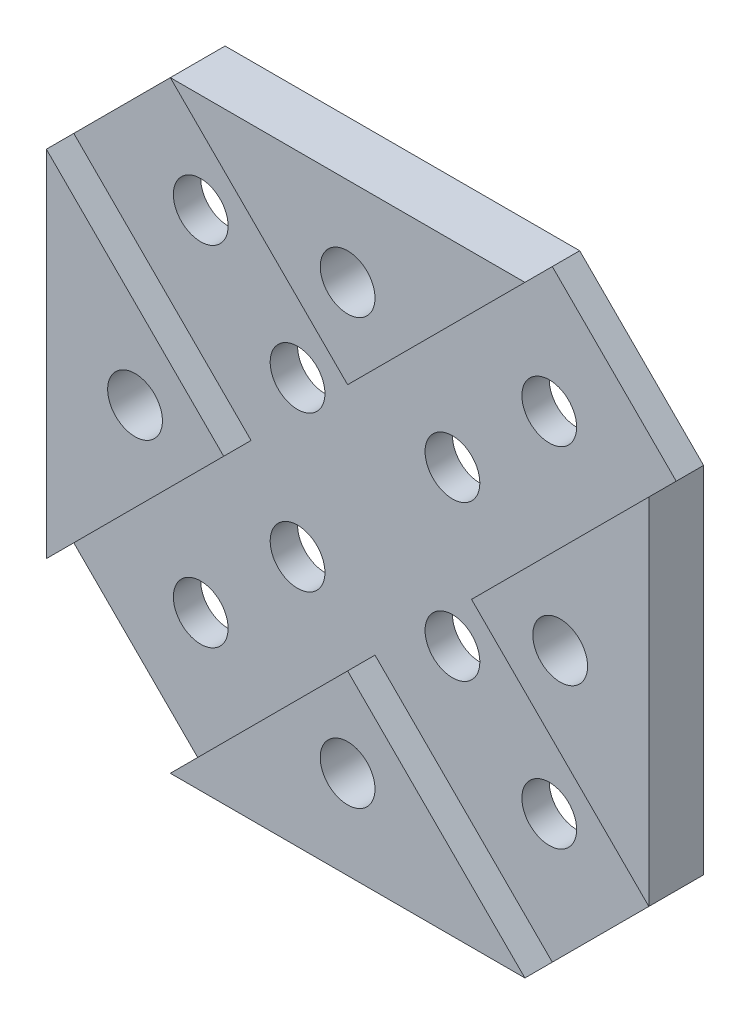
ISO-10303-21;
HEADER;
FILE_DESCRIPTION(('STEP AP214'),'2;1');
FILE_NAME('part.step','',(''),(''),'','','');
FILE_SCHEMA(('AUTOMOTIVE_DESIGN { 1 0 10303 214 1 1 1 1 }'));
ENDSEC;
DATA;
#1=APPLICATION_CONTEXT('core data for automotive mechanical design processes');
#2=APPLICATION_PROTOCOL_DEFINITION('international standard','automotive_design',2000,#1);
#3=PRODUCT_CONTEXT('',#1,'mechanical');
#4=PRODUCT('Part','Part','',(#3));
#5=PRODUCT_RELATED_PRODUCT_CATEGORY('part','',(#4));
#6=PRODUCT_DEFINITION_FORMATION('','',#4);
#7=PRODUCT_DEFINITION_CONTEXT('part definition',#1,'design');
#8=PRODUCT_DEFINITION('design','',#6,#7);
#9=PRODUCT_DEFINITION_SHAPE('','',#8);
#10=(LENGTH_UNIT() NAMED_UNIT(*) SI_UNIT(.MILLI.,.METRE.));
#11=(NAMED_UNIT(*) PLANE_ANGLE_UNIT() SI_UNIT($,.RADIAN.));
#12=(NAMED_UNIT(*) SI_UNIT($,.STERADIAN.) SOLID_ANGLE_UNIT());
#13=UNCERTAINTY_MEASURE_WITH_UNIT(LENGTH_MEASURE(1.E-05),#10,'distance_accuracy_value','');
#14=(GEOMETRIC_REPRESENTATION_CONTEXT(3) GLOBAL_UNCERTAINTY_ASSIGNED_CONTEXT((#13)) GLOBAL_UNIT_ASSIGNED_CONTEXT((#10,
#11,#12)) REPRESENTATION_CONTEXT('',''));
#15=CARTESIAN_POINT('',(0.,0.,0.));
#16=DIRECTION('',(0.,0.,1.));
#17=DIRECTION('',(1.,0.,0.));
#18=AXIS2_PLACEMENT_3D('',#15,#16,#17);
#19=CARTESIAN_POINT('',(0.,0.,10.));
#20=DIRECTION('',(0.,0.,1.));
#21=DIRECTION('',(1.,0.,0.));
#22=AXIS2_PLACEMENT_3D('',#19,#20,#21);
#23=PLANE('',#22);
#24=CARTESIAN_POINT('',(0.,38.8137084989848,10.));
#25=DIRECTION('',(0.,0.,1.));
#26=DIRECTION('',(1.,0.,0.));
#27=AXIS2_PLACEMENT_3D('',#24,#25,#26);
#28=CIRCLE('',#27,5.);
#29=CARTESIAN_POINT('',(4.99999999999997,38.8137084989848,10.));
#30=VERTEX_POINT('',#29);
#31=EDGE_CURVE('E531',#30,#30,#28,.T.);
#32=ORIENTED_EDGE('',*,*,#31,.F.);
#33=EDGE_LOOP('',(#32));
#34=FACE_BOUND('',#33,.T.);
#35=DIRECTION('',(-0.707106781186548,0.707106781186548,0.));
#36=VECTOR('',#35,1.);
#37=CARTESIAN_POINT('',(-32.3725830020304,55.,10.));
#38=LINE('',#37,#36);
#39=CARTESIAN_POINT('',(0.,22.6274169979695,10.));
#40=VERTEX_POINT('',#39);
#41=CARTESIAN_POINT('',(-32.3725830020304,55.,10.));
#42=VERTEX_POINT('',#41);
#43=EDGE_CURVE('E172',#40,#42,#38,.T.);
#44=ORIENTED_EDGE('',*,*,#43,.F.);
#45=DIRECTION('',(-0.707106781186547,-0.707106781186548,0.));
#46=VECTOR('',#45,1.);
#47=CARTESIAN_POINT('',(32.3725830020304,55.,10.));
#48=LINE('',#47,#46);
#49=CARTESIAN_POINT('',(32.3725830020304,55.,10.));
#50=VERTEX_POINT('',#49);
#51=EDGE_CURVE('E174',#50,#40,#48,.T.);
#52=ORIENTED_EDGE('',*,*,#51,.F.);
#53=DIRECTION('',(-1.,0.,0.));
#54=VECTOR('',#53,1.);
#55=CARTESIAN_POINT('',(0.,55.,10.));
#56=LINE('',#55,#54);
#57=EDGE_CURVE('E236',#50,#42,#56,.T.);
#58=ORIENTED_EDGE('',*,*,#57,.T.);
#59=EDGE_LOOP('',(#44,#52,#58));
#60=FACE_BOUND('',#59,.T.);
#61=ADVANCED_FACE('F36',(#34,#60),#23,.T.);
#62=CARTESIAN_POINT('',(38.8137084989848,0.,10.));
#63=DIRECTION('',(0.,0.,1.));
#64=DIRECTION('',(1.,0.,0.));
#65=AXIS2_PLACEMENT_3D('',#62,#63,#64);
#66=CIRCLE('',#65,5.);
#67=CARTESIAN_POINT('',(43.8137084989848,0.,10.));
#68=VERTEX_POINT('',#67);
#69=EDGE_CURVE('E563',#68,#68,#66,.T.);
#70=ORIENTED_EDGE('',*,*,#69,.F.);
#71=EDGE_LOOP('',(#70));
#72=FACE_BOUND('',#71,.T.);
#73=DIRECTION('',(0.707106781186547,0.707106781186548,0.));
#74=VECTOR('',#73,1.);
#75=CARTESIAN_POINT('',(22.6274169979695,0.,10.));
#76=LINE('',#75,#74);
#77=CARTESIAN_POINT('',(22.6274169979695,0.,10.));
#78=VERTEX_POINT('',#77);
#79=CARTESIAN_POINT('',(55.,32.3725830020305,10.));
#80=VERTEX_POINT('',#79);
#81=EDGE_CURVE('E216',#78,#80,#76,.T.);
#82=ORIENTED_EDGE('',*,*,#81,.F.);
#83=DIRECTION('',(-0.707106781186547,0.707106781186548,0.));
#84=VECTOR('',#83,1.);
#85=CARTESIAN_POINT('',(22.6274169979695,0.,10.));
#86=LINE('',#85,#84);
#87=CARTESIAN_POINT('',(55.,-32.3725830020305,10.));
#88=VERTEX_POINT('',#87);
#89=EDGE_CURVE('E213',#88,#78,#86,.T.);
#90=ORIENTED_EDGE('',*,*,#89,.F.);
#91=DIRECTION('',(0.,1.,0.));
#92=VECTOR('',#91,1.);
#93=CARTESIAN_POINT('',(55.,0.,10.));
#94=LINE('',#93,#92);
#95=EDGE_CURVE('E233',#88,#80,#94,.T.);
#96=ORIENTED_EDGE('',*,*,#95,.T.);
#97=EDGE_LOOP('',(#82,#90,#96));
#98=FACE_BOUND('',#97,.T.);
#99=ADVANCED_FACE('F327',(#72,#98),#23,.T.);
#100=CARTESIAN_POINT('',(0.,-38.8137084989848,10.));
#101=DIRECTION('',(0.,0.,1.));
#102=DIRECTION('',(1.,0.,0.));
#103=AXIS2_PLACEMENT_3D('',#100,#101,#102);
#104=CIRCLE('',#103,5.);
#105=CARTESIAN_POINT('',(5.,-38.8137084989848,10.));
#106=VERTEX_POINT('',#105);
#107=EDGE_CURVE('E363',#106,#106,#104,.T.);
#108=ORIENTED_EDGE('',*,*,#107,.F.);
#109=EDGE_LOOP('',(#108));
#110=FACE_BOUND('',#109,.T.);
#111=DIRECTION('',(0.707106781186548,-0.707106781186547,0.));
#112=VECTOR('',#111,1.);
#113=CARTESIAN_POINT('',(32.3725830020306,-54.9999999999999,10.));
#114=LINE('',#113,#112);
#115=CARTESIAN_POINT('',(0.,-22.6274169979695,10.));
#116=VERTEX_POINT('',#115);
#117=CARTESIAN_POINT('',(32.3725830020306,-54.9999999999999,10.));
#118=VERTEX_POINT('',#117);
#119=EDGE_CURVE('E211',#116,#118,#114,.T.);
#120=ORIENTED_EDGE('',*,*,#119,.F.);
#121=DIRECTION('',(0.707106781186547,0.707106781186548,0.));
#122=VECTOR('',#121,1.);
#123=CARTESIAN_POINT('',(-32.3725830020304,-55.,10.));
#124=LINE('',#123,#122);
#125=CARTESIAN_POINT('',(-32.3725830020304,-55.,10.));
#126=VERTEX_POINT('',#125);
#127=EDGE_CURVE('E208',#126,#116,#124,.T.);
#128=ORIENTED_EDGE('',*,*,#127,.F.);
#129=DIRECTION('',(-1.,0.,0.));
#130=VECTOR('',#129,1.);
#131=CARTESIAN_POINT('',(0.,-55.,10.));
#132=LINE('',#131,#130);
#133=EDGE_CURVE('E229',#118,#126,#132,.T.);
#134=ORIENTED_EDGE('',*,*,#133,.F.);
#135=EDGE_LOOP('',(#120,#128,#134));
#136=FACE_BOUND('',#135,.T.);
#137=ADVANCED_FACE('F334',(#110,#136),#23,.T.);
#138=CARTESIAN_POINT('',(-55.,0.,10.));
#139=DIRECTION('',(-1.,0.,0.));
#140=DIRECTION('',(0.,0.,1.));
#141=AXIS2_PLACEMENT_3D('',#138,#139,#140);
#142=PLANE('',#141);
#143=DIRECTION('',(0.,1.,0.));
#144=VECTOR('',#143,1.);
#145=CARTESIAN_POINT('',(-55.,0.,0.));
#146=LINE('',#145,#144);
#147=CARTESIAN_POINT('',(-55.,-32.3725830020305,0.));
#148=VERTEX_POINT('',#147);
#149=CARTESIAN_POINT('',(-55.,32.3725830020305,0.));
#150=VERTEX_POINT('',#149);
#151=EDGE_CURVE('E222',#148,#150,#146,.T.);
#152=ORIENTED_EDGE('',*,*,#151,.F.);
#153=DIRECTION('',(0.,0.,-1.));
#154=VECTOR('',#153,1.);
#155=CARTESIAN_POINT('',(-55.,-32.3725830020305,10.));
#156=LINE('',#155,#154);
#157=CARTESIAN_POINT('',(-55.,-32.3725830020305,5.));
#158=VERTEX_POINT('',#157);
#159=EDGE_CURVE('E45',#158,#148,#156,.T.);
#160=ORIENTED_EDGE('',*,*,#159,.F.);
#161=CARTESIAN_POINT('',(-55.,-32.3725830020305,10.));
#162=VERTEX_POINT('',#161);
#163=EDGE_CURVE('E11',#162,#158,#156,.T.);
#164=ORIENTED_EDGE('',*,*,#163,.F.);
#165=DIRECTION('',(0.,1.,0.));
#166=VECTOR('',#165,1.);
#167=CARTESIAN_POINT('',(-55.,0.,10.));
#168=LINE('',#167,#166);
#169=CARTESIAN_POINT('',(-55.,32.3725830020305,10.));
#170=VERTEX_POINT('',#169);
#171=EDGE_CURVE('E226',#162,#170,#168,.T.);
#172=ORIENTED_EDGE('',*,*,#171,.T.);
#173=DIRECTION('',(0.,0.,-1.));
#174=VECTOR('',#173,1.);
#175=CARTESIAN_POINT('',(-55.,32.3725830020305,10.));
#176=LINE('',#175,#174);
#177=CARTESIAN_POINT('',(-55.,32.3725830020305,5.));
#178=VERTEX_POINT('',#177);
#179=EDGE_CURVE('E260',#170,#178,#176,.T.);
#180=ORIENTED_EDGE('',*,*,#179,.T.);
#181=EDGE_CURVE('E61',#178,#150,#176,.T.);
#182=ORIENTED_EDGE('',*,*,#181,.T.);
#183=EDGE_LOOP('',(#152,#160,#164,#172,#180,#182));
#184=FACE_BOUND('',#183,.T.);
#185=ADVANCED_FACE('F38',(#184),#142,.T.);
#186=CARTESIAN_POINT('',(-43.6862915010151,-43.6862915010153,10.));
#187=DIRECTION('',(0.707106781186546,0.707106781186549,0.));
#188=DIRECTION('',(-0.707106781186549,0.707106781186546,0.));
#189=AXIS2_PLACEMENT_3D('',#186,#187,#188);
#190=PLANE('',#189);
#191=DIRECTION('',(0.,0.,-1.));
#192=VECTOR('',#191,1.);
#193=CARTESIAN_POINT('',(-32.3725830020304,-55.,10.));
#194=LINE('',#193,#192);
#195=CARTESIAN_POINT('',(-32.3725830020304,-55.,5.));
#196=VERTEX_POINT('',#195);
#197=CARTESIAN_POINT('',(-32.3725830020304,-55.,0.));
#198=VERTEX_POINT('',#197);
#199=EDGE_CURVE('E279',#196,#198,#194,.T.);
#200=ORIENTED_EDGE('',*,*,#199,.F.);
#201=DIRECTION('',(0.707106781186549,-0.707106781186546,0.));
#202=VECTOR('',#201,1.);
#203=CARTESIAN_POINT('',(-55.,-32.3725830020305,5.));
#204=LINE('',#203,#202);
#205=EDGE_CURVE('E167',#158,#196,#204,.T.);
#206=ORIENTED_EDGE('',*,*,#205,.F.);
#207=ORIENTED_EDGE('',*,*,#159,.T.);
#208=DIRECTION('',(0.707106781186549,-0.707106781186546,0.));
#209=VECTOR('',#208,1.);
#210=CARTESIAN_POINT('',(-43.6862915010151,-43.6862915010153,0.));
#211=LINE('',#210,#209);
#212=EDGE_CURVE('E240',#148,#198,#211,.T.);
#213=ORIENTED_EDGE('',*,*,#212,.T.);
#214=EDGE_LOOP('',(#200,#206,#207,#213));
#215=FACE_BOUND('',#214,.T.);
#216=ADVANCED_FACE('F359',(#215),#190,.F.);
#217=CARTESIAN_POINT('',(0.,-55.,10.));
#218=DIRECTION('',(0.,-1.,0.));
#219=DIRECTION('',(0.,0.,-1.));
#220=AXIS2_PLACEMENT_3D('',#217,#218,#219);
#221=PLANE('',#220);
#222=DIRECTION('',(-1.,0.,0.));
#223=VECTOR('',#222,1.);
#224=CARTESIAN_POINT('',(0.,-55.,0.));
#225=LINE('',#224,#223);
#226=CARTESIAN_POINT('',(32.3725830020304,-55.,0.));
#227=VERTEX_POINT('',#226);
#228=EDGE_CURVE('E243',#227,#198,#225,.T.);
#229=ORIENTED_EDGE('',*,*,#228,.F.);
#230=DIRECTION('',(0.,0.,-1.));
#231=VECTOR('',#230,1.);
#232=CARTESIAN_POINT('',(32.3725830020304,-55.,10.));
#233=LINE('',#232,#231);
#234=CARTESIAN_POINT('',(32.3725830020306,-54.9999999999999,5.));
#235=VERTEX_POINT('',#234);
#236=EDGE_CURVE('E276',#235,#227,#233,.T.);
#237=ORIENTED_EDGE('',*,*,#236,.F.);
#238=EDGE_CURVE('E277',#118,#235,#233,.T.);
#239=ORIENTED_EDGE('',*,*,#238,.F.);
#240=ORIENTED_EDGE('',*,*,#133,.T.);
#241=EDGE_CURVE('E280',#126,#196,#194,.T.);
#242=ORIENTED_EDGE('',*,*,#241,.T.);
#243=ORIENTED_EDGE('',*,*,#199,.T.);
#244=EDGE_LOOP('',(#229,#237,#239,#240,#242,#243));
#245=FACE_BOUND('',#244,.T.);
#246=ADVANCED_FACE('F374',(#245),#221,.T.);
#247=CARTESIAN_POINT('',(43.6862915010151,-43.6862915010153,10.));
#248=DIRECTION('',(0.707106781186546,-0.707106781186549,0.));
#249=DIRECTION('',(0.707106781186549,0.707106781186546,0.));
#250=AXIS2_PLACEMENT_3D('',#247,#248,#249);
#251=PLANE('',#250);
#252=DIRECTION('',(0.707106781186547,0.707106781186548,0.));
#253=VECTOR('',#252,1.);
#254=CARTESIAN_POINT('',(55.,-32.3725830020305,5.));
#255=LINE('',#254,#253);
#256=CARTESIAN_POINT('',(55.,-32.3725830020305,5.));
#257=VERTEX_POINT('',#256);
#258=EDGE_CURVE('E187',#235,#257,#255,.T.);
#259=ORIENTED_EDGE('',*,*,#258,.F.);
#260=ORIENTED_EDGE('',*,*,#236,.T.);
#261=DIRECTION('',(-0.707106781186549,-0.707106781186546,0.));
#262=VECTOR('',#261,1.);
#263=CARTESIAN_POINT('',(43.6862915010151,-43.6862915010153,0.));
#264=LINE('',#263,#262);
#265=CARTESIAN_POINT('',(55.,-32.3725830020305,0.));
#266=VERTEX_POINT('',#265);
#267=EDGE_CURVE('E246',#266,#227,#264,.T.);
#268=ORIENTED_EDGE('',*,*,#267,.F.);
#269=DIRECTION('',(0.,0.,-1.));
#270=VECTOR('',#269,1.);
#271=CARTESIAN_POINT('',(55.,-32.3725830020305,10.));
#272=LINE('',#271,#270);
#273=EDGE_CURVE('E272',#257,#266,#272,.T.);
#274=ORIENTED_EDGE('',*,*,#273,.F.);
#275=EDGE_LOOP('',(#259,#260,#268,#274));
#276=FACE_BOUND('',#275,.T.);
#277=ADVANCED_FACE('F378',(#276),#251,.T.);
#278=CARTESIAN_POINT('',(55.,0.,10.));
#279=DIRECTION('',(-1.,0.,0.));
#280=DIRECTION('',(0.,0.,1.));
#281=AXIS2_PLACEMENT_3D('',#278,#279,#280);
#282=PLANE('',#281);
#283=DIRECTION('',(0.,1.,0.));
#284=VECTOR('',#283,1.);
#285=CARTESIAN_POINT('',(55.,0.,0.));
#286=LINE('',#285,#284);
#287=CARTESIAN_POINT('',(55.,32.3725830020305,0.));
#288=VERTEX_POINT('',#287);
#289=EDGE_CURVE('E249',#266,#288,#286,.T.);
#290=ORIENTED_EDGE('',*,*,#289,.T.);
#291=DIRECTION('',(0.,0.,-1.));
#292=VECTOR('',#291,1.);
#293=CARTESIAN_POINT('',(55.,32.3725830020305,10.));
#294=LINE('',#293,#292);
#295=CARTESIAN_POINT('',(55.,32.3725830020305,5.));
#296=VERTEX_POINT('',#295);
#297=EDGE_CURVE('E269',#296,#288,#294,.T.);
#298=ORIENTED_EDGE('',*,*,#297,.F.);
#299=EDGE_CURVE('E270',#80,#296,#294,.T.);
#300=ORIENTED_EDGE('',*,*,#299,.F.);
#301=ORIENTED_EDGE('',*,*,#95,.F.);
#302=EDGE_CURVE('E273',#88,#257,#272,.T.);
#303=ORIENTED_EDGE('',*,*,#302,.T.);
#304=ORIENTED_EDGE('',*,*,#273,.T.);
#305=EDGE_LOOP('',(#290,#298,#300,#301,#303,#304));
#306=FACE_BOUND('',#305,.T.);
#307=ADVANCED_FACE('F392',(#306),#282,.F.);
#308=CARTESIAN_POINT('',(43.6862915010151,43.6862915010153,10.));
#309=DIRECTION('',(-0.707106781186546,-0.707106781186549,0.));
#310=DIRECTION('',(0.707106781186549,-0.707106781186546,0.));
#311=AXIS2_PLACEMENT_3D('',#308,#309,#310);
#312=PLANE('',#311);
#313=DIRECTION('',(0.,0.,-1.));
#314=VECTOR('',#313,1.);
#315=CARTESIAN_POINT('',(32.3725830020304,55.,10.));
#316=LINE('',#315,#314);
#317=CARTESIAN_POINT('',(32.3725830020304,55.,5.));
#318=VERTEX_POINT('',#317);
#319=CARTESIAN_POINT('',(32.3725830020304,55.,0.));
#320=VERTEX_POINT('',#319);
#321=EDGE_CURVE('E265',#318,#320,#316,.T.);
#322=ORIENTED_EDGE('',*,*,#321,.F.);
#323=DIRECTION('',(-0.707106781186549,0.707106781186546,0.));
#324=VECTOR('',#323,1.);
#325=CARTESIAN_POINT('',(32.3725830020304,55.,5.));
#326=LINE('',#325,#324);
#327=EDGE_CURVE('E196',#296,#318,#326,.T.);
#328=ORIENTED_EDGE('',*,*,#327,.F.);
#329=ORIENTED_EDGE('',*,*,#297,.T.);
#330=DIRECTION('',(-0.707106781186549,0.707106781186546,0.));
#331=VECTOR('',#330,1.);
#332=CARTESIAN_POINT('',(43.6862915010151,43.6862915010153,0.));
#333=LINE('',#332,#331);
#334=EDGE_CURVE('E252',#288,#320,#333,.T.);
#335=ORIENTED_EDGE('',*,*,#334,.T.);
#336=EDGE_LOOP('',(#322,#328,#329,#335));
#337=FACE_BOUND('',#336,.T.);
#338=ADVANCED_FACE('F406',(#337),#312,.F.);
#339=CARTESIAN_POINT('',(0.,55.,10.));
#340=DIRECTION('',(0.,-1.,0.));
#341=DIRECTION('',(0.,0.,-1.));
#342=AXIS2_PLACEMENT_3D('',#339,#340,#341);
#343=PLANE('',#342);
#344=DIRECTION('',(-1.,0.,0.));
#345=VECTOR('',#344,1.);
#346=CARTESIAN_POINT('',(0.,55.,0.));
#347=LINE('',#346,#345);
#348=CARTESIAN_POINT('',(-32.3725830020304,55.,0.));
#349=VERTEX_POINT('',#348);
#350=EDGE_CURVE('E255',#320,#349,#347,.T.);
#351=ORIENTED_EDGE('',*,*,#350,.T.);
#352=DIRECTION('',(0.,0.,-1.));
#353=VECTOR('',#352,1.);
#354=CARTESIAN_POINT('',(-32.3725830020304,55.,10.));
#355=LINE('',#354,#353);
#356=CARTESIAN_POINT('',(-32.3725830020304,55.,5.));
#357=VERTEX_POINT('',#356);
#358=EDGE_CURVE('E262',#357,#349,#355,.T.);
#359=ORIENTED_EDGE('',*,*,#358,.F.);
#360=EDGE_CURVE('E263',#42,#357,#355,.T.);
#361=ORIENTED_EDGE('',*,*,#360,.F.);
#362=ORIENTED_EDGE('',*,*,#57,.F.);
#363=EDGE_CURVE('E266',#50,#318,#316,.T.);
#364=ORIENTED_EDGE('',*,*,#363,.T.);
#365=ORIENTED_EDGE('',*,*,#321,.T.);
#366=EDGE_LOOP('',(#351,#359,#361,#362,#364,#365));
#367=FACE_BOUND('',#366,.T.);
#368=ADVANCED_FACE('F349',(#367),#343,.F.);
#369=CARTESIAN_POINT('',(-43.6862915010151,43.6862915010153,10.));
#370=DIRECTION('',(-0.707106781186546,0.707106781186549,0.));
#371=DIRECTION('',(-0.707106781186549,-0.707106781186546,0.));
#372=AXIS2_PLACEMENT_3D('',#369,#370,#371);
#373=PLANE('',#372);
#374=DIRECTION('',(-0.707106781186549,-0.707106781186546,0.));
#375=VECTOR('',#374,1.);
#376=CARTESIAN_POINT('',(-55.,32.3725830020305,5.));
#377=LINE('',#376,#375);
#378=EDGE_CURVE('E158',#357,#178,#377,.T.);
#379=ORIENTED_EDGE('',*,*,#378,.F.);
#380=ORIENTED_EDGE('',*,*,#358,.T.);
#381=DIRECTION('',(0.707106781186549,0.707106781186546,0.));
#382=VECTOR('',#381,1.);
#383=CARTESIAN_POINT('',(-43.6862915010151,43.6862915010153,0.));
#384=LINE('',#383,#382);
#385=EDGE_CURVE('E230',#150,#349,#384,.T.);
#386=ORIENTED_EDGE('',*,*,#385,.F.);
#387=ORIENTED_EDGE('',*,*,#181,.F.);
#388=EDGE_LOOP('',(#379,#380,#386,#387));
#389=FACE_BOUND('',#388,.T.);
#390=ADVANCED_FACE('F342',(#389),#373,.T.);
#391=CARTESIAN_POINT('',(-38.8137084989848,0.,10.));
#392=DIRECTION('',(0.,0.,1.));
#393=DIRECTION('',(1.,0.,0.));
#394=AXIS2_PLACEMENT_3D('',#391,#392,#393);
#395=CIRCLE('',#394,5.);
#396=CARTESIAN_POINT('',(-33.8137084989848,0.,10.));
#397=VERTEX_POINT('',#396);
#398=EDGE_CURVE('E520',#397,#397,#395,.T.);
#399=ORIENTED_EDGE('',*,*,#398,.F.);
#400=EDGE_LOOP('',(#399));
#401=FACE_BOUND('',#400,.T.);
#402=DIRECTION('',(0.707106781186548,-0.707106781186547,0.));
#403=VECTOR('',#402,1.);
#404=CARTESIAN_POINT('',(-22.6274169979694,0.,10.));
#405=LINE('',#404,#403);
#406=CARTESIAN_POINT('',(-22.6274169979694,0.,10.));
#407=VERTEX_POINT('',#406);
#408=EDGE_CURVE('E53',#170,#407,#405,.T.);
#409=ORIENTED_EDGE('',*,*,#408,.F.);
#410=ORIENTED_EDGE('',*,*,#171,.F.);
#411=DIRECTION('',(-0.707106781186549,-0.707106781186546,0.));
#412=VECTOR('',#411,1.);
#413=CARTESIAN_POINT('',(-22.6274169979694,0.,10.));
#414=LINE('',#413,#412);
#415=EDGE_CURVE('E206',#407,#162,#414,.T.);
#416=ORIENTED_EDGE('',*,*,#415,.F.);
#417=EDGE_LOOP('',(#409,#410,#416));
#418=FACE_BOUND('',#417,.T.);
#419=ADVANCED_FACE('F330',(#401,#418),#23,.T.);
#420=CARTESIAN_POINT('',(0.,0.,0.));
#421=DIRECTION('',(0.,0.,1.));
#422=DIRECTION('',(1.,0.,0.));
#423=AXIS2_PLACEMENT_3D('',#420,#421,#422);
#424=PLANE('',#423);
#425=CARTESIAN_POINT('',(14.1421356237279,-14.1421356237341,0.));
#426=DIRECTION('',(0.,0.,1.));
#427=DIRECTION('',(1.,0.,0.));
#428=AXIS2_PLACEMENT_3D('',#425,#426,#427);
#429=CIRCLE('',#428,5.);
#430=CARTESIAN_POINT('',(19.1421356237279,-14.1421356237341,0.));
#431=VERTEX_POINT('',#430);
#432=EDGE_CURVE('E487',#431,#431,#429,.T.);
#433=ORIENTED_EDGE('',*,*,#432,.T.);
#434=EDGE_LOOP('',(#433));
#435=FACE_BOUND('',#434,.T.);
#436=CARTESIAN_POINT('',(-31.819805153405,-31.8198051533843,0.));
#437=DIRECTION('',(0.,0.,1.));
#438=DIRECTION('',(1.,0.,0.));
#439=AXIS2_PLACEMENT_3D('',#436,#437,#438);
#440=CIRCLE('',#439,5.);
#441=CARTESIAN_POINT('',(-26.819805153405,-31.8198051533843,0.));
#442=VERTEX_POINT('',#441);
#443=EDGE_CURVE('E490',#442,#442,#440,.T.);
#444=ORIENTED_EDGE('',*,*,#443,.T.);
#445=EDGE_LOOP('',(#444));
#446=FACE_BOUND('',#445,.T.);
#447=CARTESIAN_POINT('',(-14.1421356237356,-14.1421356237263,0.));
#448=DIRECTION('',(0.,0.,1.));
#449=DIRECTION('',(1.,0.,0.));
#450=AXIS2_PLACEMENT_3D('',#447,#448,#449);
#451=CIRCLE('',#450,5.);
#452=CARTESIAN_POINT('',(-9.14213562373558,-14.1421356237263,0.));
#453=VERTEX_POINT('',#452);
#454=EDGE_CURVE('E527',#453,#453,#451,.T.);
#455=ORIENTED_EDGE('',*,*,#454,.T.);
#456=EDGE_LOOP('',(#455));
#457=FACE_BOUND('',#456,.T.);
#458=CARTESIAN_POINT('',(0.,38.8137084989848,0.));
#459=DIRECTION('',(0.,0.,1.));
#460=DIRECTION('',(1.,0.,0.));
#461=AXIS2_PLACEMENT_3D('',#458,#459,#460);
#462=CIRCLE('',#461,5.);
#463=CARTESIAN_POINT('',(4.99999999999997,38.8137084989848,0.));
#464=VERTEX_POINT('',#463);
#465=EDGE_CURVE('E530',#464,#464,#462,.T.);
#466=ORIENTED_EDGE('',*,*,#465,.T.);
#467=EDGE_LOOP('',(#466));
#468=FACE_BOUND('',#467,.T.);
#469=CARTESIAN_POINT('',(-14.1421356237309,14.142135623731,0.));
#470=DIRECTION('',(0.,0.,1.));
#471=DIRECTION('',(1.,0.,0.));
#472=AXIS2_PLACEMENT_3D('',#469,#470,#471);
#473=CIRCLE('',#472,5.);
#474=CARTESIAN_POINT('',(-9.14213562373094,14.142135623731,0.));
#475=VERTEX_POINT('',#474);
#476=EDGE_CURVE('E485',#475,#475,#473,.T.);
#477=ORIENTED_EDGE('',*,*,#476,.T.);
#478=EDGE_LOOP('',(#477));
#479=FACE_BOUND('',#478,.T.);
#480=CARTESIAN_POINT('',(31.8198051533981,31.8198051533912,0.));
#481=DIRECTION('',(0.,0.,1.));
#482=DIRECTION('',(1.,0.,0.));
#483=AXIS2_PLACEMENT_3D('',#480,#481,#482);
#484=CIRCLE('',#483,5.);
#485=CARTESIAN_POINT('',(36.8198051533981,31.8198051533912,0.));
#486=VERTEX_POINT('',#485);
#487=EDGE_CURVE('E481',#486,#486,#484,.T.);
#488=ORIENTED_EDGE('',*,*,#487,.T.);
#489=EDGE_LOOP('',(#488));
#490=FACE_BOUND('',#489,.T.);
#491=CARTESIAN_POINT('',(14.1421356237325,14.1421356237294,0.));
#492=DIRECTION('',(0.,0.,1.));
#493=DIRECTION('',(1.,0.,0.));
#494=AXIS2_PLACEMENT_3D('',#491,#492,#493);
#495=CIRCLE('',#494,5.);
#496=CARTESIAN_POINT('',(19.1421356237325,14.1421356237294,0.));
#497=VERTEX_POINT('',#496);
#498=EDGE_CURVE('E472',#497,#497,#495,.T.);
#499=ORIENTED_EDGE('',*,*,#498,.T.);
#500=EDGE_LOOP('',(#499));
#501=FACE_BOUND('',#500,.T.);
#502=CARTESIAN_POINT('',(31.8198051533877,-31.8198051534016,0.));
#503=DIRECTION('',(0.,0.,1.));
#504=DIRECTION('',(1.,0.,0.));
#505=AXIS2_PLACEMENT_3D('',#502,#503,#504);
#506=CIRCLE('',#505,5.);
#507=CARTESIAN_POINT('',(36.8198051533877,-31.8198051534016,0.));
#508=VERTEX_POINT('',#507);
#509=EDGE_CURVE('E482',#508,#508,#506,.T.);
#510=ORIENTED_EDGE('',*,*,#509,.T.);
#511=EDGE_LOOP('',(#510));
#512=FACE_BOUND('',#511,.T.);
#513=CARTESIAN_POINT('',(38.8137084989848,0.,0.));
#514=DIRECTION('',(0.,0.,1.));
#515=DIRECTION('',(1.,0.,0.));
#516=AXIS2_PLACEMENT_3D('',#513,#514,#515);
#517=CIRCLE('',#516,5.);
#518=CARTESIAN_POINT('',(43.8137084989848,0.,0.));
#519=VERTEX_POINT('',#518);
#520=EDGE_CURVE('E512',#519,#519,#517,.T.);
#521=ORIENTED_EDGE('',*,*,#520,.T.);
#522=EDGE_LOOP('',(#521));
#523=FACE_BOUND('',#522,.T.);
#524=CARTESIAN_POINT('',(0.,-38.8137084989848,0.));
#525=DIRECTION('',(0.,0.,1.));
#526=DIRECTION('',(1.,0.,0.));
#527=AXIS2_PLACEMENT_3D('',#524,#525,#526);
#528=CIRCLE('',#527,5.);
#529=CARTESIAN_POINT('',(5.,-38.8137084989848,0.));
#530=VERTEX_POINT('',#529);
#531=EDGE_CURVE('E516',#530,#530,#528,.T.);
#532=ORIENTED_EDGE('',*,*,#531,.T.);
#533=EDGE_LOOP('',(#532));
#534=FACE_BOUND('',#533,.T.);
#535=CARTESIAN_POINT('',(-38.8137084989848,0.,0.));
#536=DIRECTION('',(0.,0.,1.));
#537=DIRECTION('',(1.,0.,0.));
#538=AXIS2_PLACEMENT_3D('',#535,#536,#537);
#539=CIRCLE('',#538,5.);
#540=CARTESIAN_POINT('',(-33.8137084989848,0.,0.));
#541=VERTEX_POINT('',#540);
#542=EDGE_CURVE('E519',#541,#541,#539,.T.);
#543=ORIENTED_EDGE('',*,*,#542,.T.);
#544=EDGE_LOOP('',(#543));
#545=FACE_BOUND('',#544,.T.);
#546=CARTESIAN_POINT('',(-31.8198051533946,31.8198051533946,0.));
#547=DIRECTION('',(0.,0.,1.));
#548=DIRECTION('',(1.,0.,0.));
#549=AXIS2_PLACEMENT_3D('',#546,#547,#548);
#550=CIRCLE('',#549,4.99999999999999);
#551=CARTESIAN_POINT('',(-26.8198051533946,31.8198051533946,0.));
#552=VERTEX_POINT('',#551);
#553=EDGE_CURVE('E177',#552,#552,#550,.T.);
#554=ORIENTED_EDGE('',*,*,#553,.T.);
#555=EDGE_LOOP('',(#554));
#556=FACE_BOUND('',#555,.T.);
#557=ORIENTED_EDGE('',*,*,#151,.T.);
#558=ORIENTED_EDGE('',*,*,#385,.T.);
#559=ORIENTED_EDGE('',*,*,#350,.F.);
#560=ORIENTED_EDGE('',*,*,#334,.F.);
#561=ORIENTED_EDGE('',*,*,#289,.F.);
#562=ORIENTED_EDGE('',*,*,#267,.T.);
#563=ORIENTED_EDGE('',*,*,#228,.T.);
#564=ORIENTED_EDGE('',*,*,#212,.F.);
#565=EDGE_LOOP('',(#557,#558,#559,#560,#561,#562,#563,#564));
#566=FACE_BOUND('',#565,.T.);
#567=ADVANCED_FACE('F341',(#435,#446,#457,#468,#479,#490,#501,#512,#523,#534,#545,#556,#566),
#424,.F.);
#568=CARTESIAN_POINT('',(-22.6274169979694,0.,5.));
#569=DIRECTION('',(-0.707106781186547,-0.707106781186548,0.));
#570=DIRECTION('',(0.707106781186548,-0.707106781186547,0.));
#571=AXIS2_PLACEMENT_3D('',#568,#569,#570);
#572=PLANE('',#571);
#573=ORIENTED_EDGE('',*,*,#408,.T.);
#574=DIRECTION('',(0.,0.,1.));
#575=VECTOR('',#574,1.);
#576=CARTESIAN_POINT('',(-22.6274169979694,0.,5.));
#577=LINE('',#576,#575);
#578=CARTESIAN_POINT('',(-22.6274169979694,0.,5.));
#579=VERTEX_POINT('',#578);
#580=EDGE_CURVE('E149',#579,#407,#577,.T.);
#581=ORIENTED_EDGE('',*,*,#580,.F.);
#582=DIRECTION('',(0.707106781186548,-0.707106781186547,0.));
#583=VECTOR('',#582,1.);
#584=CARTESIAN_POINT('',(-22.6274169979694,0.,5.));
#585=LINE('',#584,#583);
#586=EDGE_CURVE('E153',#178,#579,#585,.T.);
#587=ORIENTED_EDGE('',*,*,#586,.F.);
#588=ORIENTED_EDGE('',*,*,#179,.F.);
#589=EDGE_LOOP('',(#573,#581,#587,#588));
#590=FACE_BOUND('',#589,.T.);
#591=ADVANCED_FACE('F151',(#590),#572,.F.);
#592=CARTESIAN_POINT('',(-32.3725830020304,55.,5.));
#593=DIRECTION('',(0.707106781186548,0.707106781186548,0.));
#594=DIRECTION('',(-0.707106781186548,0.707106781186548,0.));
#595=AXIS2_PLACEMENT_3D('',#592,#593,#594);
#596=PLANE('',#595);
#597=ORIENTED_EDGE('',*,*,#43,.T.);
#598=ORIENTED_EDGE('',*,*,#360,.T.);
#599=DIRECTION('',(-0.707106781186548,0.707106781186548,0.));
#600=VECTOR('',#599,1.);
#601=CARTESIAN_POINT('',(-32.3725830020304,55.,5.));
#602=LINE('',#601,#600);
#603=CARTESIAN_POINT('',(0.,22.6274169979695,5.));
#604=VERTEX_POINT('',#603);
#605=EDGE_CURVE('E202',#604,#357,#602,.T.);
#606=ORIENTED_EDGE('',*,*,#605,.F.);
#607=DIRECTION('',(0.,0.,1.));
#608=VECTOR('',#607,1.);
#609=CARTESIAN_POINT('',(0.,22.6274169979695,5.));
#610=LINE('',#609,#608);
#611=EDGE_CURVE('E220',#604,#40,#610,.T.);
#612=ORIENTED_EDGE('',*,*,#611,.T.);
#613=EDGE_LOOP('',(#597,#598,#606,#612));
#614=FACE_BOUND('',#613,.T.);
#615=ADVANCED_FACE('F415',(#614),#596,.F.);
#616=CARTESIAN_POINT('',(32.3725830020304,55.,5.));
#617=DIRECTION('',(-0.707106781186548,0.707106781186547,0.));
#618=DIRECTION('',(-0.707106781186547,-0.707106781186548,0.));
#619=AXIS2_PLACEMENT_3D('',#616,#617,#618);
#620=PLANE('',#619);
#621=ORIENTED_EDGE('',*,*,#51,.T.);
#622=ORIENTED_EDGE('',*,*,#611,.F.);
#623=DIRECTION('',(-0.707106781186547,-0.707106781186548,0.));
#624=VECTOR('',#623,1.);
#625=CARTESIAN_POINT('',(32.3725830020304,55.,5.));
#626=LINE('',#625,#624);
#627=EDGE_CURVE('E199',#318,#604,#626,.T.);
#628=ORIENTED_EDGE('',*,*,#627,.F.);
#629=ORIENTED_EDGE('',*,*,#363,.F.);
#630=EDGE_LOOP('',(#621,#622,#628,#629));
#631=FACE_BOUND('',#630,.T.);
#632=ADVANCED_FACE('F412',(#631),#620,.F.);
#633=CARTESIAN_POINT('',(22.6274169979695,0.,5.));
#634=DIRECTION('',(0.707106781186548,-0.707106781186547,0.));
#635=DIRECTION('',(0.707106781186547,0.707106781186548,0.));
#636=AXIS2_PLACEMENT_3D('',#633,#634,#635);
#637=PLANE('',#636);
#638=ORIENTED_EDGE('',*,*,#81,.T.);
#639=ORIENTED_EDGE('',*,*,#299,.T.);
#640=DIRECTION('',(0.707106781186547,0.707106781186548,0.));
#641=VECTOR('',#640,1.);
#642=CARTESIAN_POINT('',(22.6274169979695,0.,5.));
#643=LINE('',#642,#641);
#644=CARTESIAN_POINT('',(22.6274169979695,0.,5.));
#645=VERTEX_POINT('',#644);
#646=EDGE_CURVE('E193',#645,#296,#643,.T.);
#647=ORIENTED_EDGE('',*,*,#646,.F.);
#648=DIRECTION('',(0.,0.,1.));
#649=VECTOR('',#648,1.);
#650=CARTESIAN_POINT('',(22.6274169979695,0.,5.));
#651=LINE('',#650,#649);
#652=EDGE_CURVE('E223',#645,#78,#651,.T.);
#653=ORIENTED_EDGE('',*,*,#652,.T.);
#654=EDGE_LOOP('',(#638,#639,#647,#653));
#655=FACE_BOUND('',#654,.T.);
#656=ADVANCED_FACE('F401',(#655),#637,.F.);
#657=CARTESIAN_POINT('',(22.6274169979695,0.,5.));
#658=DIRECTION('',(0.707106781186548,0.707106781186547,0.));
#659=DIRECTION('',(-0.707106781186547,0.707106781186548,0.));
#660=AXIS2_PLACEMENT_3D('',#657,#658,#659);
#661=PLANE('',#660);
#662=ORIENTED_EDGE('',*,*,#89,.T.);
#663=ORIENTED_EDGE('',*,*,#652,.F.);
#664=DIRECTION('',(-0.707106781186547,0.707106781186548,0.));
#665=VECTOR('',#664,1.);
#666=CARTESIAN_POINT('',(22.6274169979695,0.,5.));
#667=LINE('',#666,#665);
#668=EDGE_CURVE('E190',#257,#645,#667,.T.);
#669=ORIENTED_EDGE('',*,*,#668,.F.);
#670=ORIENTED_EDGE('',*,*,#302,.F.);
#671=EDGE_LOOP('',(#662,#663,#669,#670));
#672=FACE_BOUND('',#671,.T.);
#673=ADVANCED_FACE('F397',(#672),#661,.F.);
#674=CARTESIAN_POINT('',(32.3725830020306,-54.9999999999999,5.));
#675=DIRECTION('',(-0.707106781186547,-0.707106781186548,0.));
#676=DIRECTION('',(0.707106781186548,-0.707106781186547,0.));
#677=AXIS2_PLACEMENT_3D('',#674,#675,#676);
#678=PLANE('',#677);
#679=ORIENTED_EDGE('',*,*,#119,.T.);
#680=ORIENTED_EDGE('',*,*,#238,.T.);
#681=DIRECTION('',(0.707106781186548,-0.707106781186547,0.));
#682=VECTOR('',#681,1.);
#683=CARTESIAN_POINT('',(32.3725830020306,-54.9999999999999,5.));
#684=LINE('',#683,#682);
#685=CARTESIAN_POINT('',(0.,-22.6274169979695,5.));
#686=VERTEX_POINT('',#685);
#687=EDGE_CURVE('E184',#686,#235,#684,.T.);
#688=ORIENTED_EDGE('',*,*,#687,.F.);
#689=DIRECTION('',(0.,0.,1.));
#690=VECTOR('',#689,1.);
#691=CARTESIAN_POINT('',(0.,-22.6274169979695,5.));
#692=LINE('',#691,#690);
#693=EDGE_CURVE('E157',#686,#116,#692,.T.);
#694=ORIENTED_EDGE('',*,*,#693,.T.);
#695=EDGE_LOOP('',(#679,#680,#688,#694));
#696=FACE_BOUND('',#695,.T.);
#697=ADVANCED_FACE('F369',(#696),#678,.F.);
#698=CARTESIAN_POINT('',(-32.3725830020304,-55.,5.));
#699=DIRECTION('',(0.707106781186548,-0.707106781186547,0.));
#700=DIRECTION('',(0.707106781186547,0.707106781186548,0.));
#701=AXIS2_PLACEMENT_3D('',#698,#699,#700);
#702=PLANE('',#701);
#703=ORIENTED_EDGE('',*,*,#127,.T.);
#704=ORIENTED_EDGE('',*,*,#693,.F.);
#705=DIRECTION('',(0.707106781186547,0.707106781186548,0.));
#706=VECTOR('',#705,1.);
#707=CARTESIAN_POINT('',(-32.3725830020304,-55.,5.));
#708=LINE('',#707,#706);
#709=EDGE_CURVE('E181',#196,#686,#708,.T.);
#710=ORIENTED_EDGE('',*,*,#709,.F.);
#711=ORIENTED_EDGE('',*,*,#241,.F.);
#712=EDGE_LOOP('',(#703,#704,#710,#711));
#713=FACE_BOUND('',#712,.T.);
#714=ADVANCED_FACE('F382',(#713),#702,.F.);
#715=CARTESIAN_POINT('',(-22.6274169979694,0.,5.));
#716=DIRECTION('',(-0.707106781186546,0.707106781186549,0.));
#717=DIRECTION('',(-0.707106781186549,-0.707106781186546,0.));
#718=AXIS2_PLACEMENT_3D('',#715,#716,#717);
#719=PLANE('',#718);
#720=ORIENTED_EDGE('',*,*,#415,.T.);
#721=ORIENTED_EDGE('',*,*,#163,.T.);
#722=DIRECTION('',(-0.707106781186549,-0.707106781186546,0.));
#723=VECTOR('',#722,1.);
#724=CARTESIAN_POINT('',(-22.6274169979694,0.,5.));
#725=LINE('',#724,#723);
#726=EDGE_CURVE('E161',#579,#158,#725,.T.);
#727=ORIENTED_EDGE('',*,*,#726,.F.);
#728=ORIENTED_EDGE('',*,*,#580,.T.);
#729=EDGE_LOOP('',(#720,#721,#727,#728));
#730=FACE_BOUND('',#729,.T.);
#731=ADVANCED_FACE('F162',(#730),#719,.F.);
#732=CARTESIAN_POINT('',(0.,0.,5.));
#733=DIRECTION('',(0.,0.,-1.));
#734=DIRECTION('',(-1.,0.,0.));
#735=AXIS2_PLACEMENT_3D('',#732,#733,#734);
#736=PLANE('',#735);
#737=CARTESIAN_POINT('',(14.1421356237279,-14.1421356237341,5.));
#738=DIRECTION('',(0.,0.,-1.));
#739=DIRECTION('',(-1.,0.,0.));
#740=AXIS2_PLACEMENT_3D('',#737,#738,#739);
#741=CIRCLE('',#740,5.);
#742=CARTESIAN_POINT('',(9.14213562372787,-14.1421356237341,5.));
#743=VERTEX_POINT('',#742);
#744=EDGE_CURVE('E40',#743,#743,#741,.T.);
#745=ORIENTED_EDGE('',*,*,#744,.T.);
#746=EDGE_LOOP('',(#745));
#747=FACE_BOUND('',#746,.T.);
#748=CARTESIAN_POINT('',(-31.819805153405,-31.8198051533843,5.));
#749=DIRECTION('',(0.,0.,-1.));
#750=DIRECTION('',(-1.,0.,0.));
#751=AXIS2_PLACEMENT_3D('',#748,#749,#750);
#752=CIRCLE('',#751,5.);
#753=CARTESIAN_POINT('',(-36.819805153405,-31.8198051533843,5.));
#754=VERTEX_POINT('',#753);
#755=EDGE_CURVE('E300',#754,#754,#752,.T.);
#756=ORIENTED_EDGE('',*,*,#755,.T.);
#757=EDGE_LOOP('',(#756));
#758=FACE_BOUND('',#757,.T.);
#759=CARTESIAN_POINT('',(-14.1421356237356,-14.1421356237263,5.));
#760=DIRECTION('',(0.,0.,-1.));
#761=DIRECTION('',(-1.,0.,0.));
#762=AXIS2_PLACEMENT_3D('',#759,#760,#761);
#763=CIRCLE('',#762,5.);
#764=CARTESIAN_POINT('',(-19.1421356237356,-14.1421356237263,5.));
#765=VERTEX_POINT('',#764);
#766=EDGE_CURVE('E298',#765,#765,#763,.T.);
#767=ORIENTED_EDGE('',*,*,#766,.T.);
#768=EDGE_LOOP('',(#767));
#769=FACE_BOUND('',#768,.T.);
#770=CARTESIAN_POINT('',(-14.1421356237309,14.142135623731,5.));
#771=DIRECTION('',(0.,0.,-1.));
#772=DIRECTION('',(-1.,0.,0.));
#773=AXIS2_PLACEMENT_3D('',#770,#771,#772);
#774=CIRCLE('',#773,5.);
#775=CARTESIAN_POINT('',(-19.1421356237309,14.142135623731,5.));
#776=VERTEX_POINT('',#775);
#777=EDGE_CURVE('E295',#776,#776,#774,.T.);
#778=ORIENTED_EDGE('',*,*,#777,.T.);
#779=EDGE_LOOP('',(#778));
#780=FACE_BOUND('',#779,.T.);
#781=CARTESIAN_POINT('',(31.8198051533981,31.8198051533912,5.));
#782=DIRECTION('',(0.,0.,-1.));
#783=DIRECTION('',(-1.,0.,0.));
#784=AXIS2_PLACEMENT_3D('',#781,#782,#783);
#785=CIRCLE('',#784,5.);
#786=CARTESIAN_POINT('',(26.8198051533981,31.8198051533912,5.));
#787=VERTEX_POINT('',#786);
#788=EDGE_CURVE('E292',#787,#787,#785,.T.);
#789=ORIENTED_EDGE('',*,*,#788,.T.);
#790=EDGE_LOOP('',(#789));
#791=FACE_BOUND('',#790,.T.);
#792=CARTESIAN_POINT('',(14.1421356237325,14.1421356237294,5.));
#793=DIRECTION('',(0.,0.,-1.));
#794=DIRECTION('',(-1.,0.,0.));
#795=AXIS2_PLACEMENT_3D('',#792,#793,#794);
#796=CIRCLE('',#795,5.);
#797=CARTESIAN_POINT('',(9.14213562373252,14.1421356237294,5.));
#798=VERTEX_POINT('',#797);
#799=EDGE_CURVE('E289',#798,#798,#796,.T.);
#800=ORIENTED_EDGE('',*,*,#799,.T.);
#801=EDGE_LOOP('',(#800));
#802=FACE_BOUND('',#801,.T.);
#803=CARTESIAN_POINT('',(31.8198051533877,-31.8198051534016,5.));
#804=DIRECTION('',(0.,0.,-1.));
#805=DIRECTION('',(-1.,0.,0.));
#806=AXIS2_PLACEMENT_3D('',#803,#804,#805);
#807=CIRCLE('',#806,5.);
#808=CARTESIAN_POINT('',(26.8198051533877,-31.8198051534016,5.));
#809=VERTEX_POINT('',#808);
#810=EDGE_CURVE('E286',#809,#809,#807,.T.);
#811=ORIENTED_EDGE('',*,*,#810,.T.);
#812=EDGE_LOOP('',(#811));
#813=FACE_BOUND('',#812,.T.);
#814=CARTESIAN_POINT('',(-31.8198051533946,31.8198051533946,5.));
#815=DIRECTION('',(0.,0.,-1.));
#816=DIRECTION('',(-1.,0.,0.));
#817=AXIS2_PLACEMENT_3D('',#814,#815,#816);
#818=CIRCLE('',#817,4.99999999999999);
#819=CARTESIAN_POINT('',(-36.8198051533946,31.8198051533946,5.));
#820=VERTEX_POINT('',#819);
#821=EDGE_CURVE('E283',#820,#820,#818,.T.);
#822=ORIENTED_EDGE('',*,*,#821,.T.);
#823=EDGE_LOOP('',(#822));
#824=FACE_BOUND('',#823,.T.);
#825=ORIENTED_EDGE('',*,*,#586,.T.);
#826=ORIENTED_EDGE('',*,*,#726,.T.);
#827=ORIENTED_EDGE('',*,*,#205,.T.);
#828=ORIENTED_EDGE('',*,*,#709,.T.);
#829=ORIENTED_EDGE('',*,*,#687,.T.);
#830=ORIENTED_EDGE('',*,*,#258,.T.);
#831=ORIENTED_EDGE('',*,*,#668,.T.);
#832=ORIENTED_EDGE('',*,*,#646,.T.);
#833=ORIENTED_EDGE('',*,*,#327,.T.);
#834=ORIENTED_EDGE('',*,*,#627,.T.);
#835=ORIENTED_EDGE('',*,*,#605,.T.);
#836=ORIENTED_EDGE('',*,*,#378,.T.);
#837=EDGE_LOOP('',(#825,#826,#827,#828,#829,#830,#831,#832,#833,#834,#835,#836));
#838=FACE_BOUND('',#837,.T.);
#839=ADVANCED_FACE('F169',(#747,#758,#769,#780,#791,#802,#813,#824,#838),#736,.F.);
#840=CARTESIAN_POINT('',(-31.8198051533946,31.8198051533946,0.));
#841=DIRECTION('',(0.,0.,1.));
#842=DIRECTION('',(1.,0.,0.));
#843=AXIS2_PLACEMENT_3D('',#840,#841,#842);
#844=CYLINDRICAL_SURFACE('',#843,4.99999999999999);
#845=ORIENTED_EDGE('',*,*,#553,.F.);
#846=EDGE_LOOP('',(#845));
#847=FACE_BOUND('',#846,.T.);
#848=ORIENTED_EDGE('',*,*,#821,.F.);
#849=EDGE_LOOP('',(#848));
#850=FACE_BOUND('',#849,.T.);
#851=ADVANCED_FACE('F442',(#847,#850),#844,.F.);
#852=CARTESIAN_POINT('',(31.8198051533877,-31.8198051534016,0.));
#853=DIRECTION('',(0.,0.,1.));
#854=DIRECTION('',(1.,0.,0.));
#855=AXIS2_PLACEMENT_3D('',#852,#853,#854);
#856=CYLINDRICAL_SURFACE('',#855,5.);
#857=ORIENTED_EDGE('',*,*,#509,.F.);
#858=EDGE_LOOP('',(#857));
#859=FACE_BOUND('',#858,.T.);
#860=ORIENTED_EDGE('',*,*,#810,.F.);
#861=EDGE_LOOP('',(#860));
#862=FACE_BOUND('',#861,.T.);
#863=ADVANCED_FACE('F446',(#859,#862),#856,.F.);
#864=CARTESIAN_POINT('',(14.1421356237325,14.1421356237294,0.));
#865=DIRECTION('',(0.,0.,1.));
#866=DIRECTION('',(1.,0.,0.));
#867=AXIS2_PLACEMENT_3D('',#864,#865,#866);
#868=CYLINDRICAL_SURFACE('',#867,5.);
#869=ORIENTED_EDGE('',*,*,#498,.F.);
#870=EDGE_LOOP('',(#869));
#871=FACE_BOUND('',#870,.T.);
#872=ORIENTED_EDGE('',*,*,#799,.F.);
#873=EDGE_LOOP('',(#872));
#874=FACE_BOUND('',#873,.T.);
#875=ADVANCED_FACE('F451',(#871,#874),#868,.F.);
#876=CARTESIAN_POINT('',(31.8198051533981,31.8198051533912,0.));
#877=DIRECTION('',(0.,0.,1.));
#878=DIRECTION('',(1.,0.,0.));
#879=AXIS2_PLACEMENT_3D('',#876,#877,#878);
#880=CYLINDRICAL_SURFACE('',#879,5.);
#881=ORIENTED_EDGE('',*,*,#487,.F.);
#882=EDGE_LOOP('',(#881));
#883=FACE_BOUND('',#882,.T.);
#884=ORIENTED_EDGE('',*,*,#788,.F.);
#885=EDGE_LOOP('',(#884));
#886=FACE_BOUND('',#885,.T.);
#887=ADVANCED_FACE('F457',(#883,#886),#880,.F.);
#888=CARTESIAN_POINT('',(-14.1421356237309,14.142135623731,0.));
#889=DIRECTION('',(0.,0.,1.));
#890=DIRECTION('',(1.,0.,0.));
#891=AXIS2_PLACEMENT_3D('',#888,#889,#890);
#892=CYLINDRICAL_SURFACE('',#891,5.);
#893=ORIENTED_EDGE('',*,*,#476,.F.);
#894=EDGE_LOOP('',(#893));
#895=FACE_BOUND('',#894,.T.);
#896=ORIENTED_EDGE('',*,*,#777,.F.);
#897=EDGE_LOOP('',(#896));
#898=FACE_BOUND('',#897,.T.);
#899=ADVANCED_FACE('F460',(#895,#898),#892,.F.);
#900=CARTESIAN_POINT('',(-14.1421356237356,-14.1421356237263,0.));
#901=DIRECTION('',(0.,0.,1.));
#902=DIRECTION('',(1.,0.,0.));
#903=AXIS2_PLACEMENT_3D('',#900,#901,#902);
#904=CYLINDRICAL_SURFACE('',#903,5.);
#905=ORIENTED_EDGE('',*,*,#454,.F.);
#906=EDGE_LOOP('',(#905));
#907=FACE_BOUND('',#906,.T.);
#908=ORIENTED_EDGE('',*,*,#766,.F.);
#909=EDGE_LOOP('',(#908));
#910=FACE_BOUND('',#909,.T.);
#911=ADVANCED_FACE('F321',(#907,#910),#904,.F.);
#912=CARTESIAN_POINT('',(-31.819805153405,-31.8198051533843,0.));
#913=DIRECTION('',(0.,0.,1.));
#914=DIRECTION('',(1.,0.,0.));
#915=AXIS2_PLACEMENT_3D('',#912,#913,#914);
#916=CYLINDRICAL_SURFACE('',#915,5.);
#917=ORIENTED_EDGE('',*,*,#443,.F.);
#918=EDGE_LOOP('',(#917));
#919=FACE_BOUND('',#918,.T.);
#920=ORIENTED_EDGE('',*,*,#755,.F.);
#921=EDGE_LOOP('',(#920));
#922=FACE_BOUND('',#921,.T.);
#923=ADVANCED_FACE('F311',(#919,#922),#916,.F.);
#924=CARTESIAN_POINT('',(14.1421356237279,-14.1421356237341,0.));
#925=DIRECTION('',(0.,0.,1.));
#926=DIRECTION('',(1.,0.,0.));
#927=AXIS2_PLACEMENT_3D('',#924,#925,#926);
#928=CYLINDRICAL_SURFACE('',#927,5.);
#929=ORIENTED_EDGE('',*,*,#432,.F.);
#930=EDGE_LOOP('',(#929));
#931=FACE_BOUND('',#930,.T.);
#932=ORIENTED_EDGE('',*,*,#744,.F.);
#933=EDGE_LOOP('',(#932));
#934=FACE_BOUND('',#933,.T.);
#935=ADVANCED_FACE('F308',(#931,#934),#928,.F.);
#936=CARTESIAN_POINT('',(-38.8137084989848,0.,0.));
#937=DIRECTION('',(0.,0.,1.));
#938=DIRECTION('',(1.,0.,0.));
#939=AXIS2_PLACEMENT_3D('',#936,#937,#938);
#940=CYLINDRICAL_SURFACE('',#939,5.);
#941=ORIENTED_EDGE('',*,*,#542,.F.);
#942=EDGE_LOOP('',(#941));
#943=FACE_BOUND('',#942,.T.);
#944=ORIENTED_EDGE('',*,*,#398,.T.);
#945=EDGE_LOOP('',(#944));
#946=FACE_BOUND('',#945,.T.);
#947=ADVANCED_FACE('F310',(#943,#946),#940,.F.);
#948=CARTESIAN_POINT('',(0.,-38.8137084989848,0.));
#949=DIRECTION('',(0.,0.,1.));
#950=DIRECTION('',(1.,0.,0.));
#951=AXIS2_PLACEMENT_3D('',#948,#949,#950);
#952=CYLINDRICAL_SURFACE('',#951,5.);
#953=ORIENTED_EDGE('',*,*,#531,.F.);
#954=EDGE_LOOP('',(#953));
#955=FACE_BOUND('',#954,.T.);
#956=ORIENTED_EDGE('',*,*,#107,.T.);
#957=EDGE_LOOP('',(#956));
#958=FACE_BOUND('',#957,.T.);
#959=ADVANCED_FACE('F318',(#955,#958),#952,.F.);
#960=CARTESIAN_POINT('',(38.8137084989848,0.,0.));
#961=DIRECTION('',(0.,0.,1.));
#962=DIRECTION('',(1.,0.,0.));
#963=AXIS2_PLACEMENT_3D('',#960,#961,#962);
#964=CYLINDRICAL_SURFACE('',#963,5.);
#965=ORIENTED_EDGE('',*,*,#520,.F.);
#966=EDGE_LOOP('',(#965));
#967=FACE_BOUND('',#966,.T.);
#968=ORIENTED_EDGE('',*,*,#69,.T.);
#969=EDGE_LOOP('',(#968));
#970=FACE_BOUND('',#969,.T.);
#971=ADVANCED_FACE('F548',(#967,#970),#964,.F.);
#972=CARTESIAN_POINT('',(0.,38.8137084989848,0.));
#973=DIRECTION('',(0.,0.,1.));
#974=DIRECTION('',(1.,0.,0.));
#975=AXIS2_PLACEMENT_3D('',#972,#973,#974);
#976=CYLINDRICAL_SURFACE('',#975,5.);
#977=ORIENTED_EDGE('',*,*,#465,.F.);
#978=EDGE_LOOP('',(#977));
#979=FACE_BOUND('',#978,.T.);
#980=ORIENTED_EDGE('',*,*,#31,.T.);
#981=EDGE_LOOP('',(#980));
#982=FACE_BOUND('',#981,.T.);
#983=ADVANCED_FACE('F545',(#979,#982),#976,.F.);
#984=CLOSED_SHELL('',(#61,#99,#137,#185,#216,#246,#277,#307,#338,#368,#390,#419,#567,#591,#615,
#632,#656,#673,#697,#714,#731,#839,#851,#863,#875,#887,#899,#911,#923,#935,#947,#959,#971,#983));
#985=MANIFOLD_SOLID_BREP('B2',#984);
#986=ADVANCED_BREP_SHAPE_REPRESENTATION('',(#18,#985),#14);
#987=SHAPE_DEFINITION_REPRESENTATION(#9,#986);
ENDSEC;
END-ISO-10303-21;
